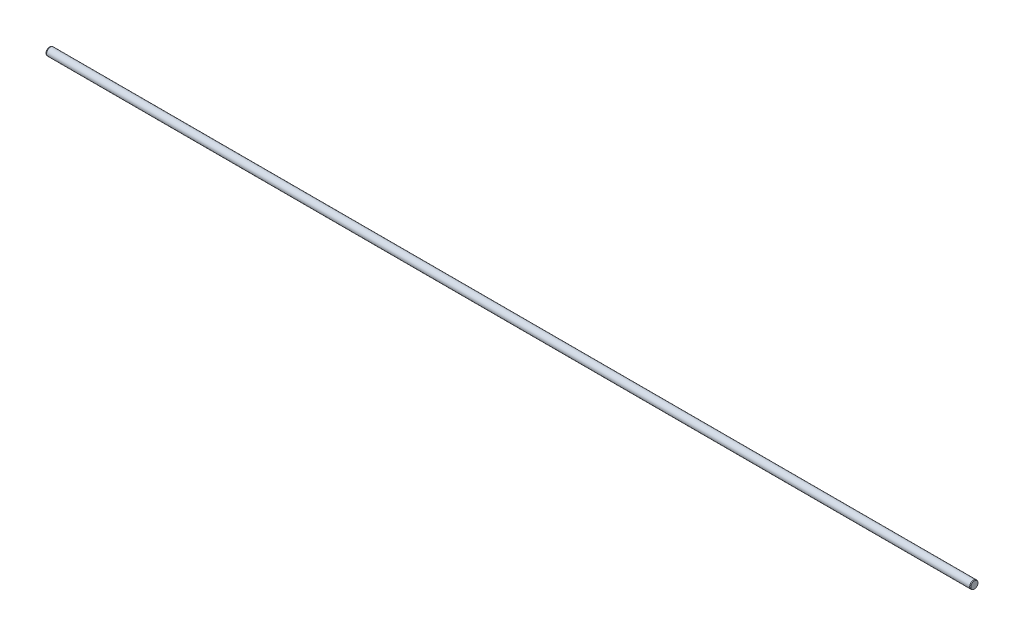
ISO-10303-21;
HEADER;
FILE_DESCRIPTION(('STEP AP214'),'2;1');
FILE_NAME('part.step','',(''),(''),'','','');
FILE_SCHEMA(('AUTOMOTIVE_DESIGN { 1 0 10303 214 1 1 1 1 }'));
ENDSEC;
DATA;
#1=APPLICATION_CONTEXT('core data for automotive mechanical design processes');
#2=APPLICATION_PROTOCOL_DEFINITION('international standard','automotive_design',2000,#1);
#3=PRODUCT_CONTEXT('',#1,'mechanical');
#4=PRODUCT('Part','Part','',(#3));
#5=PRODUCT_RELATED_PRODUCT_CATEGORY('part','',(#4));
#6=PRODUCT_DEFINITION_FORMATION('','',#4);
#7=PRODUCT_DEFINITION_CONTEXT('part definition',#1,'design');
#8=PRODUCT_DEFINITION('design','',#6,#7);
#9=PRODUCT_DEFINITION_SHAPE('','',#8);
#10=(LENGTH_UNIT() NAMED_UNIT(*) SI_UNIT(.MILLI.,.METRE.));
#11=(NAMED_UNIT(*) PLANE_ANGLE_UNIT() SI_UNIT($,.RADIAN.));
#12=(NAMED_UNIT(*) SI_UNIT($,.STERADIAN.) SOLID_ANGLE_UNIT());
#13=UNCERTAINTY_MEASURE_WITH_UNIT(LENGTH_MEASURE(1.E-05),#10,'distance_accuracy_value','');
#14=(GEOMETRIC_REPRESENTATION_CONTEXT(3) GLOBAL_UNCERTAINTY_ASSIGNED_CONTEXT((#13)) GLOBAL_UNIT_ASSIGNED_CONTEXT((#10,
#11,#12)) REPRESENTATION_CONTEXT('',''));
#15=CARTESIAN_POINT('',(0.,0.,0.));
#16=DIRECTION('',(0.,0.,1.));
#17=DIRECTION('',(1.,0.,0.));
#18=AXIS2_PLACEMENT_3D('',#15,#16,#17);
#19=CARTESIAN_POINT('',(600.,0.,0.));
#20=DIRECTION('',(-1.,0.,0.));
#21=DIRECTION('',(0.,0.,1.));
#22=AXIS2_PLACEMENT_3D('',#19,#20,#21);
#23=CYLINDRICAL_SURFACE('',#22,5.);
#24=CARTESIAN_POINT('',(598.880384757729,0.,0.));
#25=DIRECTION('',(1.,0.,0.));
#26=DIRECTION('',(0.,0.,-1.));
#27=AXIS2_PLACEMENT_3D('',#24,#25,#26);
#28=CIRCLE('',#27,5.);
#29=CARTESIAN_POINT('',(598.880384757729,0.,5.00000000000002));
#30=VERTEX_POINT('',#29);
#31=EDGE_CURVE('E37',#30,#30,#28,.F.);
#32=ORIENTED_EDGE('',*,*,#31,.T.);
#33=EDGE_LOOP('',(#32));
#34=FACE_BOUND('',#33,.T.);
#35=CARTESIAN_POINT('',(-598.880384757732,0.,0.));
#36=DIRECTION('',(1.,0.,0.));
#37=DIRECTION('',(0.,0.,-1.));
#38=AXIS2_PLACEMENT_3D('',#35,#36,#37);
#39=CIRCLE('',#38,5.);
#40=CARTESIAN_POINT('',(-598.880384757732,0.,-5.));
#41=VERTEX_POINT('',#40);
#42=EDGE_CURVE('E41',#41,#41,#39,.T.);
#43=ORIENTED_EDGE('',*,*,#42,.T.);
#44=EDGE_LOOP('',(#43));
#45=FACE_BOUND('',#44,.T.);
#46=ADVANCED_FACE('F30',(#34,#45),#23,.T.);
#47=CARTESIAN_POINT('',(600.,0.,0.));
#48=DIRECTION('',(1.,0.,0.));
#49=DIRECTION('',(0.,0.,-1.));
#50=AXIS2_PLACEMENT_3D('',#47,#48,#49);
#51=PLANE('',#50);
#52=CARTESIAN_POINT('',(600.,0.,0.));
#53=DIRECTION('',(1.,0.,0.));
#54=DIRECTION('',(0.,0.,-1.));
#55=AXIS2_PLACEMENT_3D('',#52,#53,#54);
#56=CIRCLE('',#55,4.69999999999993);
#57=CARTESIAN_POINT('',(600.,0.,4.69999999999994));
#58=VERTEX_POINT('',#57);
#59=EDGE_CURVE('E45',#58,#58,#56,.T.);
#60=ORIENTED_EDGE('',*,*,#59,.T.);
#61=EDGE_LOOP('',(#60));
#62=FACE_BOUND('',#61,.T.);
#63=ADVANCED_FACE('F51',(#62),#51,.T.);
#64=CARTESIAN_POINT('',(-600.,0.,0.));
#65=DIRECTION('',(1.,0.,0.));
#66=DIRECTION('',(0.,0.,-1.));
#67=AXIS2_PLACEMENT_3D('',#64,#65,#66);
#68=PLANE('',#67);
#69=CARTESIAN_POINT('',(-600.,0.,0.));
#70=DIRECTION('',(1.,0.,0.));
#71=DIRECTION('',(0.,0.,-1.));
#72=AXIS2_PLACEMENT_3D('',#69,#70,#71);
#73=CIRCLE('',#72,4.70000000000076);
#74=CARTESIAN_POINT('',(-600.,0.,-4.70000000000076));
#75=VERTEX_POINT('',#74);
#76=EDGE_CURVE('E10',#75,#75,#73,.F.);
#77=ORIENTED_EDGE('',*,*,#76,.T.);
#78=EDGE_LOOP('',(#77));
#79=FACE_BOUND('',#78,.T.);
#80=ADVANCED_FACE('F55',(#79),#68,.F.);
#81=CARTESIAN_POINT('',(600.,0.,0.));
#82=DIRECTION('',(-1.,0.,0.));
#83=DIRECTION('',(0.,0.,1.));
#84=AXIS2_PLACEMENT_3D('',#81,#82,#83);
#85=CONICAL_SURFACE('',#84,4.69999999999993,0.261799387799086);
#86=CARTESIAN_POINT('',(598.880384757729,0.,5.00000000000002));
#87=CARTESIAN_POINT('',(598.892047416502,0.,4.99687500000001));
#88=CARTESIAN_POINT('',(598.903710075276,0.,4.99375000000001));
#89=CARTESIAN_POINT('',(598.927035392823,0.,4.98750000000001));
#90=CARTESIAN_POINT('',(598.938698051597,0.,4.98437500000001));
#91=CARTESIAN_POINT('',(598.962023369144,0.,4.97812500000001));
#92=CARTESIAN_POINT('',(598.973686027918,0.,4.97500000000001));
#93=CARTESIAN_POINT('',(598.997011345465,0.,4.96875000000001));
#94=CARTESIAN_POINT('',(599.008674004239,0.,4.96562500000001));
#95=CARTESIAN_POINT('',(599.031999321786,0.,4.959375));
#96=CARTESIAN_POINT('',(599.04366198056,0.,4.95625));
#97=CARTESIAN_POINT('',(599.066987298107,0.,4.95));
#98=CARTESIAN_POINT('',(599.078649956881,0.,4.946875));
#99=CARTESIAN_POINT('',(599.101975274428,0.,4.94062500000001));
#100=CARTESIAN_POINT('',(599.113637933202,0.,4.9375));
#101=CARTESIAN_POINT('',(599.136963250749,0.,4.93125));
#102=CARTESIAN_POINT('',(599.148625909523,0.,4.928125));
#103=CARTESIAN_POINT('',(599.17195122707,0.,4.921875));
#104=CARTESIAN_POINT('',(599.183613885844,0.,4.91875));
#105=CARTESIAN_POINT('',(599.206939203391,0.,4.91249999999999));
#106=CARTESIAN_POINT('',(599.218601862165,0.,4.90937499999999));
#107=CARTESIAN_POINT('',(599.241927179712,0.,4.90312499999999));
#108=CARTESIAN_POINT('',(599.253589838486,0.,4.89999999999999));
#109=CARTESIAN_POINT('',(599.276915156033,0.,4.89374999999999));
#110=CARTESIAN_POINT('',(599.288577814807,0.,4.89062499999999));
#111=CARTESIAN_POINT('',(599.311903132354,0.,4.88437499999999));
#112=CARTESIAN_POINT('',(599.323565791128,0.,4.88124999999998));
#113=CARTESIAN_POINT('',(599.346891108675,0.,4.87499999999998));
#114=CARTESIAN_POINT('',(599.358553767449,0.,4.87187499999999));
#115=CARTESIAN_POINT('',(599.381879084996,0.,4.86562499999998));
#116=CARTESIAN_POINT('',(599.39354174377,0.,4.86249999999997));
#117=CARTESIAN_POINT('',(599.416867061317,0.,4.85624999999998));
#118=CARTESIAN_POINT('',(599.428529720091,0.,4.85312499999998));
#119=CARTESIAN_POINT('',(599.451855037638,0.,4.84687499999998));
#120=CARTESIAN_POINT('',(599.463517696412,0.,4.84374999999998));
#121=CARTESIAN_POINT('',(599.486843013959,0.,4.83749999999997));
#122=CARTESIAN_POINT('',(599.498505672733,0.,4.83437499999997));
#123=CARTESIAN_POINT('',(599.52183099028,0.,4.82812499999997));
#124=CARTESIAN_POINT('',(599.533493649054,0.,4.82499999999997));
#125=CARTESIAN_POINT('',(599.556818966601,0.,4.81874999999997));
#126=CARTESIAN_POINT('',(599.568481625375,0.,4.81562499999997));
#127=CARTESIAN_POINT('',(599.591806942922,0.,4.80937499999997));
#128=CARTESIAN_POINT('',(599.603469601696,0.,4.80624999999996));
#129=CARTESIAN_POINT('',(599.626794919243,0.,4.79999999999996));
#130=CARTESIAN_POINT('',(599.638457578017,0.,4.79687499999997));
#131=CARTESIAN_POINT('',(599.661782895564,0.,4.79062499999997));
#132=CARTESIAN_POINT('',(599.673445554338,0.,4.78749999999996));
#133=CARTESIAN_POINT('',(599.696770871885,0.,4.78124999999996));
#134=CARTESIAN_POINT('',(599.708433530658,0.,4.77812499999996));
#135=CARTESIAN_POINT('',(599.731758848206,0.,4.77187499999996));
#136=CARTESIAN_POINT('',(599.743421506979,0.,4.76874999999996));
#137=CARTESIAN_POINT('',(599.766746824527,0.,4.76249999999995));
#138=CARTESIAN_POINT('',(599.7784094833,0.,4.75937499999995));
#139=CARTESIAN_POINT('',(599.801734800848,0.,4.75312499999995));
#140=CARTESIAN_POINT('',(599.813397459621,0.,4.74999999999996));
#141=CARTESIAN_POINT('',(599.836722777169,0.,4.74374999999996));
#142=CARTESIAN_POINT('',(599.848385435942,0.,4.74062499999995));
#143=CARTESIAN_POINT('',(599.87171075349,0.,4.73437499999995));
#144=CARTESIAN_POINT('',(599.883373412263,0.,4.73124999999995));
#145=CARTESIAN_POINT('',(599.906698729811,0.,4.72499999999995));
#146=CARTESIAN_POINT('',(599.918361388584,0.,4.72187499999995));
#147=CARTESIAN_POINT('',(599.941686706132,0.,4.71562499999995));
#148=CARTESIAN_POINT('',(599.953349364905,0.,4.71249999999994));
#149=CARTESIAN_POINT('',(599.976674682453,0.,4.70624999999994));
#150=CARTESIAN_POINT('',(599.988337341226,0.,4.70312499999993));
#151=CARTESIAN_POINT('',(600.,0.,4.69999999999994));
#152=B_SPLINE_CURVE_WITH_KNOTS('',3,(#86,#87,#88,#89,#90,#91,#92,#93,#94,#95,#96,#97,#98,#99,
#100,#101,#102,#103,#104,#105,#106,#107,#108,#109,#110,#111,#112,#113,#114,#115,#116,#117,#118,
#119,#120,#121,#122,#123,#124,#125,#126,#127,#128,#129,#130,#131,#132,#133,#134,#135,#136,#137,
#138,#139,#140,#141,#142,#143,#144,#145,#146,#147,#148,#149,#150,#151),.UNSPECIFIED.,.F.,.F.,(4,
2,2,2,2,2,2,2,2,2,2,2,2,2,2,2,2,2,2,2,2,2,2,2,2,2,2,2,2,2,2,2,4),(0.,0.0362222184858374,
0.0724444369716749,0.108666655457512,0.14488887394335,0.181111092429187,0.217333310915132,
0.253555529400969,0.289777747886806,0.325999966372644,0.362222184858481,0.398444403344426,
0.434666621830263,0.470888840316101,0.507111058801938,0.543333277287775,0.57955549577372,
0.615777714259557,0.651999932745395,0.688222151231232,0.724444369717069,0.760666588202907,
0.796888806688851,0.833111025174689,0.869333243660526,0.905555462146364,0.941777680632201,
0.977999899118146,1.01422211760398,1.05044433608982,1.08666655457566,1.1228887730615,
1.15911099154744),.UNSPECIFIED.);
#153=EDGE_CURVE('BSEAM53',#30,#58,#152,.T.);
#154=ORIENTED_EDGE('',*,*,#31,.F.);
#155=ORIENTED_EDGE('',*,*,#59,.F.);
#156=ORIENTED_EDGE('',*,*,#153,.T.);
#157=ORIENTED_EDGE('',*,*,#153,.F.);
#158=EDGE_LOOP('',(#154,#156,#155,#157));
#159=FACE_BOUND('',#158,.T.);
#160=ADVANCED_FACE('F53',(#159),#85,.T.);
#161=CARTESIAN_POINT('',(-598.880384757732,0.,0.));
#162=DIRECTION('',(1.,0.,0.));
#163=DIRECTION('',(0.,0.,-1.));
#164=AXIS2_PLACEMENT_3D('',#161,#162,#163);
#165=CONICAL_SURFACE('',#164,5.,0.261799387799086);
#166=ORIENTED_EDGE('',*,*,#76,.F.);
#167=EDGE_LOOP('',(#166));
#168=FACE_BOUND('',#167,.T.);
#169=ORIENTED_EDGE('',*,*,#42,.F.);
#170=EDGE_LOOP('',(#169));
#171=FACE_BOUND('',#170,.T.);
#172=ADVANCED_FACE('F32',(#168,#171),#165,.T.);
#173=CLOSED_SHELL('',(#46,#63,#80,#160,#172));
#174=MANIFOLD_SOLID_BREP('B2',#173);
#175=ADVANCED_BREP_SHAPE_REPRESENTATION('',(#18,#174),#14);
#176=SHAPE_DEFINITION_REPRESENTATION(#9,#175);
ENDSEC;
END-ISO-10303-21;
